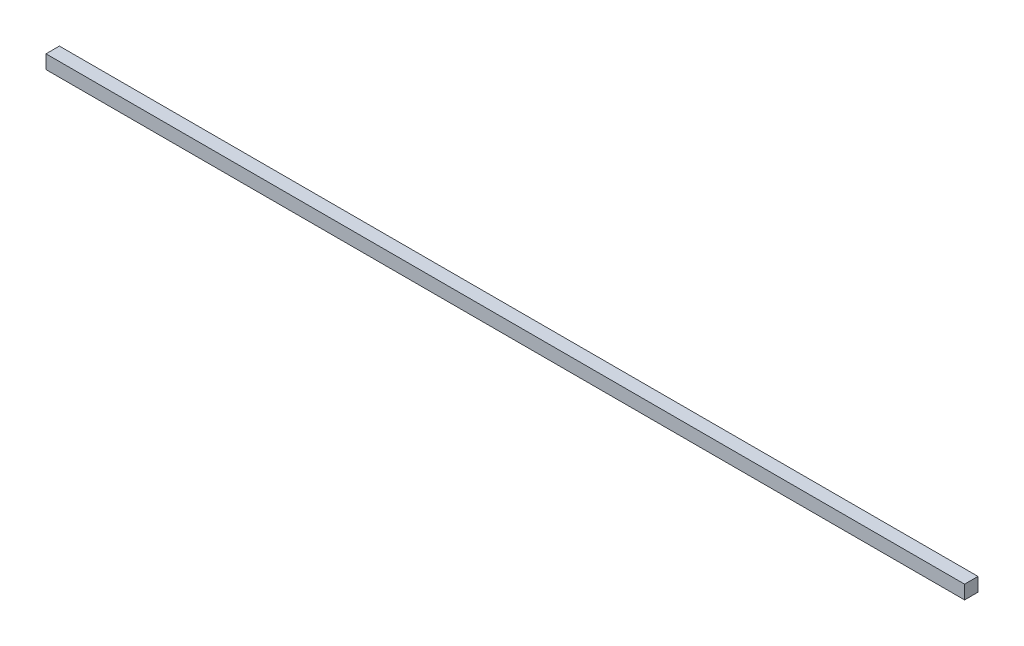
ISO-10303-21;
HEADER;
FILE_DESCRIPTION(('STEP AP214'),'2;1');
FILE_NAME('part.step','',(''),(''),'','','');
FILE_SCHEMA(('AUTOMOTIVE_DESIGN { 1 0 10303 214 1 1 1 1 }'));
ENDSEC;
DATA;
#1=APPLICATION_CONTEXT('core data for automotive mechanical design processes');
#2=APPLICATION_PROTOCOL_DEFINITION('international standard','automotive_design',2000,#1);
#3=PRODUCT_CONTEXT('',#1,'mechanical');
#4=PRODUCT('Part','Part','',(#3));
#5=PRODUCT_RELATED_PRODUCT_CATEGORY('part','',(#4));
#6=PRODUCT_DEFINITION_FORMATION('','',#4);
#7=PRODUCT_DEFINITION_CONTEXT('part definition',#1,'design');
#8=PRODUCT_DEFINITION('design','',#6,#7);
#9=PRODUCT_DEFINITION_SHAPE('','',#8);
#10=(LENGTH_UNIT() NAMED_UNIT(*) SI_UNIT(.MILLI.,.METRE.));
#11=(NAMED_UNIT(*) PLANE_ANGLE_UNIT() SI_UNIT($,.RADIAN.));
#12=(NAMED_UNIT(*) SI_UNIT($,.STERADIAN.) SOLID_ANGLE_UNIT());
#13=UNCERTAINTY_MEASURE_WITH_UNIT(LENGTH_MEASURE(1.E-05),#10,'distance_accuracy_value','');
#14=(GEOMETRIC_REPRESENTATION_CONTEXT(3) GLOBAL_UNCERTAINTY_ASSIGNED_CONTEXT((#13)) GLOBAL_UNIT_ASSIGNED_CONTEXT((#10,
#11,#12)) REPRESENTATION_CONTEXT('',''));
#15=CARTESIAN_POINT('',(0.,0.,0.));
#16=DIRECTION('',(0.,0.,1.));
#17=DIRECTION('',(1.,0.,0.));
#18=AXIS2_PLACEMENT_3D('',#15,#16,#17);
#19=CARTESIAN_POINT('',(921.870072854918,62.1049629237067,5.));
#20=DIRECTION('',(-1.,0.,0.));
#21=DIRECTION('',(0.,0.,1.));
#22=AXIS2_PLACEMENT_3D('',#19,#20,#21);
#23=PLANE('',#22);
#24=DIRECTION('',(0.,1.,0.));
#25=VECTOR('',#24,1.);
#26=CARTESIAN_POINT('',(921.870072854918,62.1049629237067,0.));
#27=LINE('',#26,#25);
#28=CARTESIAN_POINT('',(921.870072854918,57.0049629237085,0.));
#29=VERTEX_POINT('',#28);
#30=CARTESIAN_POINT('',(921.870072854918,62.1049629237067,0.));
#31=VERTEX_POINT('',#30);
#32=EDGE_CURVE('E98',#29,#31,#27,.T.);
#33=ORIENTED_EDGE('',*,*,#32,.T.);
#34=DIRECTION('',(0.,0.,-1.));
#35=VECTOR('',#34,1.);
#36=CARTESIAN_POINT('',(921.870072854918,62.1049629237067,5.));
#37=LINE('',#36,#35);
#38=CARTESIAN_POINT('',(921.870072854918,62.1049629237067,5.));
#39=VERTEX_POINT('',#38);
#40=EDGE_CURVE('E11',#39,#31,#37,.T.);
#41=ORIENTED_EDGE('',*,*,#40,.F.);
#42=DIRECTION('',(0.,1.,0.));
#43=VECTOR('',#42,1.);
#44=CARTESIAN_POINT('',(921.870072854918,62.1049629237067,5.));
#45=LINE('',#44,#43);
#46=CARTESIAN_POINT('',(921.870072854918,57.0049629237085,5.));
#47=VERTEX_POINT('',#46);
#48=EDGE_CURVE('E86',#47,#39,#45,.T.);
#49=ORIENTED_EDGE('',*,*,#48,.F.);
#50=DIRECTION('',(0.,0.,-1.));
#51=VECTOR('',#50,1.);
#52=CARTESIAN_POINT('',(921.870072854918,57.0049629237085,5.));
#53=LINE('',#52,#51);
#54=EDGE_CURVE('E94',#47,#29,#53,.T.);
#55=ORIENTED_EDGE('',*,*,#54,.T.);
#56=EDGE_LOOP('',(#33,#41,#49,#55));
#57=FACE_BOUND('',#56,.T.);
#58=ADVANCED_FACE('F35',(#57),#23,.F.);
#59=CARTESIAN_POINT('',(921.870072854918,62.1049629237067,5.));
#60=DIRECTION('',(0.,-1.,0.));
#61=DIRECTION('',(1.,0.,0.));
#62=AXIS2_PLACEMENT_3D('',#59,#60,#61);
#63=PLANE('',#62);
#64=DIRECTION('',(-1.,0.,0.));
#65=VECTOR('',#64,1.);
#66=CARTESIAN_POINT('',(921.870072854918,62.1049629237067,0.));
#67=LINE('',#66,#65);
#68=CARTESIAN_POINT('',(579.5034218999,62.1049629237116,0.));
#69=VERTEX_POINT('',#68);
#70=EDGE_CURVE('E90',#31,#69,#67,.T.);
#71=ORIENTED_EDGE('',*,*,#70,.T.);
#72=DIRECTION('',(0.,0.,-1.));
#73=VECTOR('',#72,1.);
#74=CARTESIAN_POINT('',(579.5034218999,62.1049629237116,5.));
#75=LINE('',#74,#73);
#76=CARTESIAN_POINT('',(579.5034218999,62.1049629237116,5.));
#77=VERTEX_POINT('',#76);
#78=EDGE_CURVE('E43',#77,#69,#75,.T.);
#79=ORIENTED_EDGE('',*,*,#78,.F.);
#80=DIRECTION('',(-1.,0.,0.));
#81=VECTOR('',#80,1.);
#82=CARTESIAN_POINT('',(921.870072854918,62.1049629237067,5.));
#83=LINE('',#82,#81);
#84=EDGE_CURVE('E81',#39,#77,#83,.T.);
#85=ORIENTED_EDGE('',*,*,#84,.F.);
#86=ORIENTED_EDGE('',*,*,#40,.T.);
#87=EDGE_LOOP('',(#71,#79,#85,#86));
#88=FACE_BOUND('',#87,.T.);
#89=ADVANCED_FACE('F89',(#88),#63,.F.);
#90=CARTESIAN_POINT('',(579.5034218999,57.0049629237098,5.));
#91=DIRECTION('',(1.,0.,0.));
#92=DIRECTION('',(0.,0.,-1.));
#93=AXIS2_PLACEMENT_3D('',#90,#91,#92);
#94=PLANE('',#93);
#95=DIRECTION('',(0.,-1.,0.));
#96=VECTOR('',#95,1.);
#97=CARTESIAN_POINT('',(579.5034218999,57.0049629237098,0.));
#98=LINE('',#97,#96);
#99=CARTESIAN_POINT('',(579.5034218999,57.0049629237098,0.));
#100=VERTEX_POINT('',#99);
#101=EDGE_CURVE('E68',#69,#100,#98,.T.);
#102=ORIENTED_EDGE('',*,*,#101,.T.);
#103=DIRECTION('',(0.,0.,-1.));
#104=VECTOR('',#103,1.);
#105=CARTESIAN_POINT('',(579.5034218999,57.0049629237098,5.));
#106=LINE('',#105,#104);
#107=CARTESIAN_POINT('',(579.5034218999,57.0049629237098,5.));
#108=VERTEX_POINT('',#107);
#109=EDGE_CURVE('E91',#108,#100,#106,.T.);
#110=ORIENTED_EDGE('',*,*,#109,.F.);
#111=DIRECTION('',(0.,-1.,0.));
#112=VECTOR('',#111,1.);
#113=CARTESIAN_POINT('',(579.5034218999,57.0049629237098,5.));
#114=LINE('',#113,#112);
#115=EDGE_CURVE('E84',#77,#108,#114,.T.);
#116=ORIENTED_EDGE('',*,*,#115,.F.);
#117=ORIENTED_EDGE('',*,*,#78,.T.);
#118=EDGE_LOOP('',(#102,#110,#116,#117));
#119=FACE_BOUND('',#118,.T.);
#120=ADVANCED_FACE('F92',(#119),#94,.F.);
#121=CARTESIAN_POINT('',(921.870072854918,57.0049629237085,5.));
#122=DIRECTION('',(0.,1.,0.));
#123=DIRECTION('',(-1.,0.,0.));
#124=AXIS2_PLACEMENT_3D('',#121,#122,#123);
#125=PLANE('',#124);
#126=DIRECTION('',(1.,0.,0.));
#127=VECTOR('',#126,1.);
#128=CARTESIAN_POINT('',(921.870072854918,57.0049629237085,0.));
#129=LINE('',#128,#127);
#130=EDGE_CURVE('E74',#100,#29,#129,.T.);
#131=ORIENTED_EDGE('',*,*,#130,.T.);
#132=ORIENTED_EDGE('',*,*,#54,.F.);
#133=DIRECTION('',(1.,0.,0.));
#134=VECTOR('',#133,1.);
#135=CARTESIAN_POINT('',(921.870072854918,57.0049629237085,5.));
#136=LINE('',#135,#134);
#137=EDGE_CURVE('E51',#108,#47,#136,.T.);
#138=ORIENTED_EDGE('',*,*,#137,.F.);
#139=ORIENTED_EDGE('',*,*,#109,.T.);
#140=EDGE_LOOP('',(#131,#132,#138,#139));
#141=FACE_BOUND('',#140,.T.);
#142=ADVANCED_FACE('F105',(#141),#125,.F.);
#143=CARTESIAN_POINT('',(0.,0.,5.));
#144=DIRECTION('',(0.,0.,-1.));
#145=DIRECTION('',(-1.,0.,0.));
#146=AXIS2_PLACEMENT_3D('',#143,#144,#145);
#147=PLANE('',#146);
#148=ORIENTED_EDGE('',*,*,#48,.T.);
#149=ORIENTED_EDGE('',*,*,#84,.T.);
#150=ORIENTED_EDGE('',*,*,#115,.T.);
#151=ORIENTED_EDGE('',*,*,#137,.T.);
#152=EDGE_LOOP('',(#148,#149,#150,#151));
#153=FACE_BOUND('',#152,.T.);
#154=ADVANCED_FACE('F82',(#153),#147,.F.);
#155=CARTESIAN_POINT('',(0.,0.,0.));
#156=DIRECTION('',(0.,0.,-1.));
#157=DIRECTION('',(-1.,0.,0.));
#158=AXIS2_PLACEMENT_3D('',#155,#156,#157);
#159=PLANE('',#158);
#160=ORIENTED_EDGE('',*,*,#32,.F.);
#161=ORIENTED_EDGE('',*,*,#130,.F.);
#162=ORIENTED_EDGE('',*,*,#101,.F.);
#163=ORIENTED_EDGE('',*,*,#70,.F.);
#164=EDGE_LOOP('',(#160,#161,#162,#163));
#165=FACE_BOUND('',#164,.T.);
#166=ADVANCED_FACE('F108',(#165),#159,.T.);
#167=CLOSED_SHELL('',(#58,#89,#120,#142,#154,#166));
#168=MANIFOLD_SOLID_BREP('B2',#167);
#169=ADVANCED_BREP_SHAPE_REPRESENTATION('',(#18,#168),#14);
#170=SHAPE_DEFINITION_REPRESENTATION(#9,#169);
ENDSEC;
END-ISO-10303-21;
